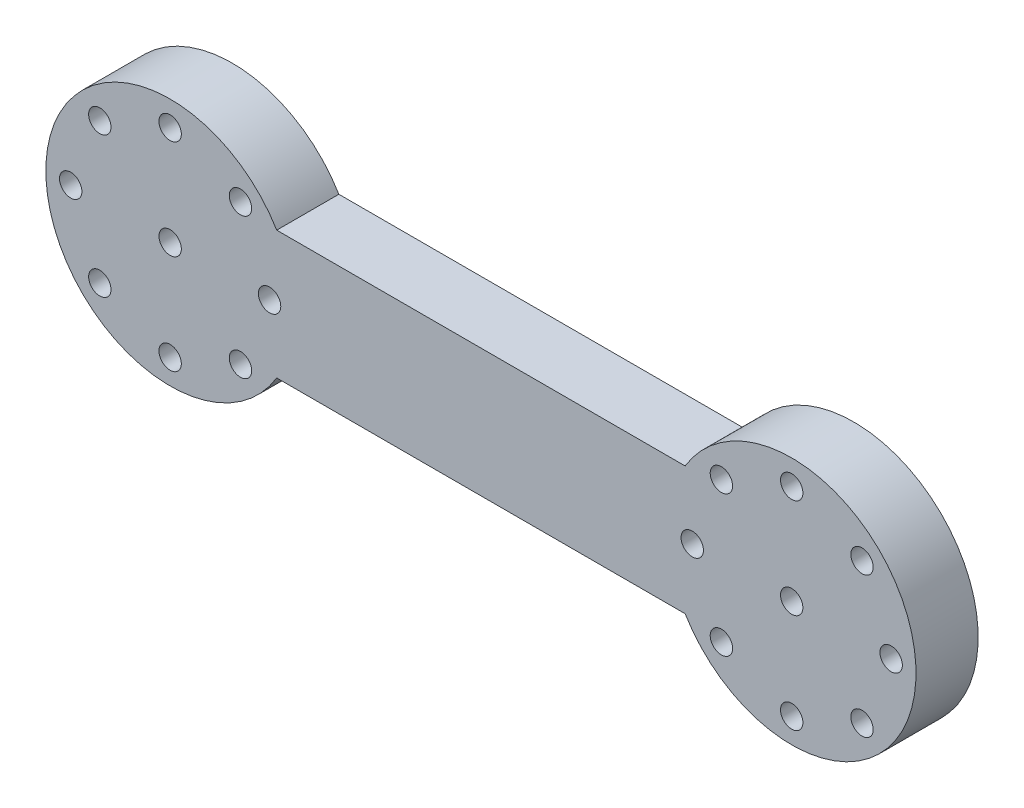
ISO-10303-21;
HEADER;
FILE_DESCRIPTION(('STEP AP214'),'2;1');
FILE_NAME('part.step','',(''),(''),'','','');
FILE_SCHEMA(('AUTOMOTIVE_DESIGN { 1 0 10303 214 1 1 1 1 }'));
ENDSEC;
DATA;
#1=APPLICATION_CONTEXT('core data for automotive mechanical design processes');
#2=APPLICATION_PROTOCOL_DEFINITION('international standard','automotive_design',2000,#1);
#3=PRODUCT_CONTEXT('',#1,'mechanical');
#4=PRODUCT('Part','Part','',(#3));
#5=PRODUCT_RELATED_PRODUCT_CATEGORY('part','',(#4));
#6=PRODUCT_DEFINITION_FORMATION('','',#4);
#7=PRODUCT_DEFINITION_CONTEXT('part definition',#1,'design');
#8=PRODUCT_DEFINITION('design','',#6,#7);
#9=PRODUCT_DEFINITION_SHAPE('','',#8);
#10=(LENGTH_UNIT() NAMED_UNIT(*) SI_UNIT(.MILLI.,.METRE.));
#11=(NAMED_UNIT(*) PLANE_ANGLE_UNIT() SI_UNIT($,.RADIAN.));
#12=(NAMED_UNIT(*) SI_UNIT($,.STERADIAN.) SOLID_ANGLE_UNIT());
#13=UNCERTAINTY_MEASURE_WITH_UNIT(LENGTH_MEASURE(1.E-05),#10,'distance_accuracy_value','');
#14=(GEOMETRIC_REPRESENTATION_CONTEXT(3) GLOBAL_UNCERTAINTY_ASSIGNED_CONTEXT((#13)) GLOBAL_UNIT_ASSIGNED_CONTEXT((#10,
#11,#12)) REPRESENTATION_CONTEXT('',''));
#15=CARTESIAN_POINT('',(0.,0.,0.));
#16=DIRECTION('',(0.,0.,1.));
#17=DIRECTION('',(1.,0.,0.));
#18=AXIS2_PLACEMENT_3D('',#15,#16,#17);
#19=CARTESIAN_POINT('',(0.,0.,5.));
#20=DIRECTION('',(0.,0.,-1.));
#21=DIRECTION('',(-1.,0.,0.));
#22=AXIS2_PLACEMENT_3D('',#19,#20,#21);
#23=CYLINDRICAL_SURFACE('',#22,2.45);
#24=CARTESIAN_POINT('',(0.,0.,0.));
#25=DIRECTION('',(0.,0.,1.));
#26=DIRECTION('',(1.,0.,0.));
#27=AXIS2_PLACEMENT_3D('',#24,#25,#26);
#28=CIRCLE('',#27,2.45);
#29=CARTESIAN_POINT('',(2.45,0.,0.));
#30=VERTEX_POINT('',#29);
#31=EDGE_CURVE('E96',#30,#30,#28,.T.);
#32=ORIENTED_EDGE('',*,*,#31,.F.);
#33=EDGE_LOOP('',(#32));
#34=FACE_BOUND('',#33,.T.);
#35=CARTESIAN_POINT('',(0.,0.,2.47));
#36=DIRECTION('',(0.,0.,1.));
#37=DIRECTION('',(1.,0.,0.));
#38=AXIS2_PLACEMENT_3D('',#35,#36,#37);
#39=CIRCLE('',#38,2.45);
#40=CARTESIAN_POINT('',(2.45,0.,2.47));
#41=VERTEX_POINT('',#40);
#42=EDGE_CURVE('E218',#41,#41,#39,.T.);
#43=ORIENTED_EDGE('',*,*,#42,.T.);
#44=EDGE_LOOP('',(#43));
#45=FACE_BOUND('',#44,.T.);
#46=ADVANCED_FACE('F32',(#34,#45),#23,.F.);
#47=CARTESIAN_POINT('',(0.,0.,5.));
#48=DIRECTION('',(0.,0.,1.));
#49=DIRECTION('',(1.,0.,0.));
#50=AXIS2_PLACEMENT_3D('',#47,#48,#49);
#51=PLANE('',#50);
#52=CARTESIAN_POINT('',(50.,8.00000000000001,5.));
#53=DIRECTION('',(0.,0.,1.));
#54=DIRECTION('',(-1.,0.,0.));
#55=AXIS2_PLACEMENT_3D('',#52,#53,#54);
#56=CIRCLE('',#55,0.899999999999997);
#57=CARTESIAN_POINT('',(49.1,8.00000000000001,5.));
#58=VERTEX_POINT('',#57);
#59=EDGE_CURVE('E171',#58,#58,#56,.T.);
#60=ORIENTED_EDGE('',*,*,#59,.F.);
#61=EDGE_LOOP('',(#60));
#62=FACE_BOUND('',#61,.T.);
#63=CARTESIAN_POINT('',(55.6568542494924,5.65685424949239,5.));
#64=DIRECTION('',(0.,0.,1.));
#65=DIRECTION('',(-1.,0.,0.));
#66=AXIS2_PLACEMENT_3D('',#63,#64,#65);
#67=CIRCLE('',#66,0.899999999999997);
#68=CARTESIAN_POINT('',(54.7568542494924,5.65685424949239,5.));
#69=VERTEX_POINT('',#68);
#70=EDGE_CURVE('E161',#69,#69,#67,.T.);
#71=ORIENTED_EDGE('',*,*,#70,.F.);
#72=EDGE_LOOP('',(#71));
#73=FACE_BOUND('',#72,.T.);
#74=CARTESIAN_POINT('',(58.,0.,5.));
#75=DIRECTION('',(0.,0.,1.));
#76=DIRECTION('',(-1.,0.,0.));
#77=AXIS2_PLACEMENT_3D('',#74,#75,#76);
#78=CIRCLE('',#77,0.899999999999997);
#79=CARTESIAN_POINT('',(57.1,0.,5.));
#80=VERTEX_POINT('',#79);
#81=EDGE_CURVE('E158',#80,#80,#78,.T.);
#82=ORIENTED_EDGE('',*,*,#81,.F.);
#83=EDGE_LOOP('',(#82));
#84=FACE_BOUND('',#83,.T.);
#85=CARTESIAN_POINT('',(55.6568542494924,-5.65685424949237,5.));
#86=DIRECTION('',(0.,0.,1.));
#87=DIRECTION('',(-1.,0.,0.));
#88=AXIS2_PLACEMENT_3D('',#85,#86,#87);
#89=CIRCLE('',#88,0.899999999999997);
#90=CARTESIAN_POINT('',(54.7568542494924,-5.65685424949237,5.));
#91=VERTEX_POINT('',#90);
#92=EDGE_CURVE('E155',#91,#91,#89,.T.);
#93=ORIENTED_EDGE('',*,*,#92,.F.);
#94=EDGE_LOOP('',(#93));
#95=FACE_BOUND('',#94,.T.);
#96=CARTESIAN_POINT('',(50.,-7.99999999999999,5.));
#97=DIRECTION('',(0.,0.,1.));
#98=DIRECTION('',(-1.,0.,0.));
#99=AXIS2_PLACEMENT_3D('',#96,#97,#98);
#100=CIRCLE('',#99,0.899999999999997);
#101=CARTESIAN_POINT('',(49.1,-7.99999999999999,5.));
#102=VERTEX_POINT('',#101);
#103=EDGE_CURVE('E151',#102,#102,#100,.T.);
#104=ORIENTED_EDGE('',*,*,#103,.F.);
#105=EDGE_LOOP('',(#104));
#106=FACE_BOUND('',#105,.T.);
#107=CARTESIAN_POINT('',(44.3431457505076,-5.65685424949238,5.));
#108=DIRECTION('',(0.,0.,1.));
#109=DIRECTION('',(-1.,0.,0.));
#110=AXIS2_PLACEMENT_3D('',#107,#108,#109);
#111=CIRCLE('',#110,0.899999999999997);
#112=CARTESIAN_POINT('',(43.4431457505076,-5.65685424949238,5.));
#113=VERTEX_POINT('',#112);
#114=EDGE_CURVE('E147',#113,#113,#111,.T.);
#115=ORIENTED_EDGE('',*,*,#114,.F.);
#116=EDGE_LOOP('',(#115));
#117=FACE_BOUND('',#116,.T.);
#118=CARTESIAN_POINT('',(42.,0.,5.));
#119=DIRECTION('',(0.,0.,1.));
#120=DIRECTION('',(-1.,0.,0.));
#121=AXIS2_PLACEMENT_3D('',#118,#119,#120);
#122=CIRCLE('',#121,0.899999999999997);
#123=CARTESIAN_POINT('',(41.1,0.,5.));
#124=VERTEX_POINT('',#123);
#125=EDGE_CURVE('E143',#124,#124,#122,.T.);
#126=ORIENTED_EDGE('',*,*,#125,.F.);
#127=EDGE_LOOP('',(#126));
#128=FACE_BOUND('',#127,.T.);
#129=CARTESIAN_POINT('',(44.3431457505076,5.65685424949239,5.));
#130=DIRECTION('',(0.,0.,1.));
#131=DIRECTION('',(-1.,0.,0.));
#132=AXIS2_PLACEMENT_3D('',#129,#130,#131);
#133=CIRCLE('',#132,0.899999999999997);
#134=CARTESIAN_POINT('',(43.4431457505076,5.65685424949239,5.));
#135=VERTEX_POINT('',#134);
#136=EDGE_CURVE('E139',#135,#135,#133,.T.);
#137=ORIENTED_EDGE('',*,*,#136,.F.);
#138=EDGE_LOOP('',(#137));
#139=FACE_BOUND('',#138,.T.);
#140=CARTESIAN_POINT('',(-5.65685424949238,-5.65685424949238,5.));
#141=DIRECTION('',(0.,0.,1.));
#142=DIRECTION('',(1.,0.,0.));
#143=AXIS2_PLACEMENT_3D('',#140,#141,#142);
#144=CIRCLE('',#143,0.899999999999999);
#145=CARTESIAN_POINT('',(-4.75685424949238,-5.65685424949238,5.));
#146=VERTEX_POINT('',#145);
#147=EDGE_CURVE('E135',#146,#146,#144,.T.);
#148=ORIENTED_EDGE('',*,*,#147,.F.);
#149=EDGE_LOOP('',(#148));
#150=FACE_BOUND('',#149,.T.);
#151=CARTESIAN_POINT('',(0.,-8.,5.));
#152=DIRECTION('',(0.,0.,1.));
#153=DIRECTION('',(1.,0.,0.));
#154=AXIS2_PLACEMENT_3D('',#151,#152,#153);
#155=CIRCLE('',#154,0.9);
#156=CARTESIAN_POINT('',(0.900000000000001,-8.,5.));
#157=VERTEX_POINT('',#156);
#158=EDGE_CURVE('E131',#157,#157,#155,.T.);
#159=ORIENTED_EDGE('',*,*,#158,.F.);
#160=EDGE_LOOP('',(#159));
#161=FACE_BOUND('',#160,.T.);
#162=CARTESIAN_POINT('',(5.65685424949238,-5.65685424949238,5.));
#163=DIRECTION('',(0.,0.,1.));
#164=DIRECTION('',(1.,0.,0.));
#165=AXIS2_PLACEMENT_3D('',#162,#163,#164);
#166=CIRCLE('',#165,0.899999999999999);
#167=CARTESIAN_POINT('',(6.55685424949238,-5.65685424949238,5.));
#168=VERTEX_POINT('',#167);
#169=EDGE_CURVE('E127',#168,#168,#166,.T.);
#170=ORIENTED_EDGE('',*,*,#169,.F.);
#171=EDGE_LOOP('',(#170));
#172=FACE_BOUND('',#171,.T.);
#173=CARTESIAN_POINT('',(8.,0.,5.));
#174=DIRECTION('',(0.,0.,1.));
#175=DIRECTION('',(1.,0.,0.));
#176=AXIS2_PLACEMENT_3D('',#173,#174,#175);
#177=CIRCLE('',#176,0.9);
#178=CARTESIAN_POINT('',(8.9,0.,5.));
#179=VERTEX_POINT('',#178);
#180=EDGE_CURVE('E123',#179,#179,#177,.T.);
#181=ORIENTED_EDGE('',*,*,#180,.F.);
#182=EDGE_LOOP('',(#181));
#183=FACE_BOUND('',#182,.T.);
#184=CARTESIAN_POINT('',(5.65685424949238,5.65685424949238,5.));
#185=DIRECTION('',(0.,0.,1.));
#186=DIRECTION('',(1.,0.,0.));
#187=AXIS2_PLACEMENT_3D('',#184,#185,#186);
#188=CIRCLE('',#187,0.899999999999999);
#189=CARTESIAN_POINT('',(6.55685424949238,5.65685424949238,5.));
#190=VERTEX_POINT('',#189);
#191=EDGE_CURVE('E119',#190,#190,#188,.T.);
#192=ORIENTED_EDGE('',*,*,#191,.F.);
#193=EDGE_LOOP('',(#192));
#194=FACE_BOUND('',#193,.T.);
#195=CARTESIAN_POINT('',(0.,8.,5.));
#196=DIRECTION('',(0.,0.,1.));
#197=DIRECTION('',(1.,0.,0.));
#198=AXIS2_PLACEMENT_3D('',#195,#196,#197);
#199=CIRCLE('',#198,0.9);
#200=CARTESIAN_POINT('',(0.899999999999999,8.,5.));
#201=VERTEX_POINT('',#200);
#202=EDGE_CURVE('E115',#201,#201,#199,.T.);
#203=ORIENTED_EDGE('',*,*,#202,.F.);
#204=EDGE_LOOP('',(#203));
#205=FACE_BOUND('',#204,.T.);
#206=CARTESIAN_POINT('',(-5.65685424949238,5.65685424949238,5.));
#207=DIRECTION('',(0.,0.,1.));
#208=DIRECTION('',(1.,0.,0.));
#209=AXIS2_PLACEMENT_3D('',#206,#207,#208);
#210=CIRCLE('',#209,0.899999999999999);
#211=CARTESIAN_POINT('',(-4.75685424949238,5.65685424949238,5.));
#212=VERTEX_POINT('',#211);
#213=EDGE_CURVE('E111',#212,#212,#210,.T.);
#214=ORIENTED_EDGE('',*,*,#213,.F.);
#215=EDGE_LOOP('',(#214));
#216=FACE_BOUND('',#215,.T.);
#217=CARTESIAN_POINT('',(-8.,0.,5.));
#218=DIRECTION('',(0.,0.,1.));
#219=DIRECTION('',(1.,0.,0.));
#220=AXIS2_PLACEMENT_3D('',#217,#218,#219);
#221=CIRCLE('',#220,0.899999999999999);
#222=CARTESIAN_POINT('',(-7.1,0.,5.));
#223=VERTEX_POINT('',#222);
#224=EDGE_CURVE('E107',#223,#223,#221,.T.);
#225=ORIENTED_EDGE('',*,*,#224,.F.);
#226=EDGE_LOOP('',(#225));
#227=FACE_BOUND('',#226,.T.);
#228=DIRECTION('',(1.,0.,0.));
#229=VECTOR('',#228,1.);
#230=CARTESIAN_POINT('',(0.,-5.14773184930253,5.));
#231=LINE('',#230,#229);
#232=CARTESIAN_POINT('',(8.57326406963394,-5.14773184930253,5.));
#233=VERTEX_POINT('',#232);
#234=CARTESIAN_POINT('',(41.4267359303661,-5.14773184930253,5.));
#235=VERTEX_POINT('',#234);
#236=EDGE_CURVE('E92',#233,#235,#231,.T.);
#237=ORIENTED_EDGE('',*,*,#236,.T.);
#238=CARTESIAN_POINT('',(50.,0.,5.));
#239=DIRECTION('',(0.,0.,1.));
#240=DIRECTION('',(1.,0.,0.));
#241=AXIS2_PLACEMENT_3D('',#238,#239,#240);
#242=CIRCLE('',#241,10.);
#243=CARTESIAN_POINT('',(41.4267359303661,5.14773184930253,5.));
#244=VERTEX_POINT('',#243);
#245=EDGE_CURVE('E49',#235,#244,#242,.T.);
#246=ORIENTED_EDGE('',*,*,#245,.T.);
#247=DIRECTION('',(-1.,0.,0.));
#248=VECTOR('',#247,1.);
#249=CARTESIAN_POINT('',(0.,5.14773184930253,5.));
#250=LINE('',#249,#248);
#251=CARTESIAN_POINT('',(8.57326406963394,5.14773184930253,5.));
#252=VERTEX_POINT('',#251);
#253=EDGE_CURVE('E89',#244,#252,#250,.T.);
#254=ORIENTED_EDGE('',*,*,#253,.T.);
#255=CARTESIAN_POINT('',(0.,0.,5.));
#256=DIRECTION('',(0.,0.,1.));
#257=DIRECTION('',(1.,0.,0.));
#258=AXIS2_PLACEMENT_3D('',#255,#256,#257);
#259=CIRCLE('',#258,10.);
#260=EDGE_CURVE('E202',#252,#233,#259,.T.);
#261=ORIENTED_EDGE('',*,*,#260,.T.);
#262=EDGE_LOOP('',(#237,#246,#254,#261));
#263=FACE_BOUND('',#262,.T.);
#264=CARTESIAN_POINT('',(0.,0.,5.));
#265=DIRECTION('',(0.,0.,1.));
#266=DIRECTION('',(1.,0.,0.));
#267=AXIS2_PLACEMENT_3D('',#264,#265,#266);
#268=CIRCLE('',#267,0.9);
#269=CARTESIAN_POINT('',(0.9,0.,5.));
#270=VERTEX_POINT('',#269);
#271=EDGE_CURVE('E212',#270,#270,#268,.T.);
#272=ORIENTED_EDGE('',*,*,#271,.F.);
#273=EDGE_LOOP('',(#272));
#274=FACE_BOUND('',#273,.T.);
#275=CARTESIAN_POINT('',(50.,0.,5.));
#276=DIRECTION('',(0.,0.,1.));
#277=DIRECTION('',(-1.,0.,0.));
#278=AXIS2_PLACEMENT_3D('',#275,#276,#277);
#279=CIRCLE('',#278,0.899999999999997);
#280=CARTESIAN_POINT('',(49.1,0.,5.));
#281=VERTEX_POINT('',#280);
#282=EDGE_CURVE('E208',#281,#281,#279,.T.);
#283=ORIENTED_EDGE('',*,*,#282,.F.);
#284=EDGE_LOOP('',(#283));
#285=FACE_BOUND('',#284,.T.);
#286=ADVANCED_FACE('F228',(#62,#73,#84,#95,#106,#117,#128,#139,#150,#161,#172,#183,#194,#205,
#216,#227,#263,#274,#285),#51,.T.);
#287=CARTESIAN_POINT('',(0.,0.,0.));
#288=DIRECTION('',(0.,0.,1.));
#289=DIRECTION('',(1.,0.,0.));
#290=AXIS2_PLACEMENT_3D('',#287,#288,#289);
#291=PLANE('',#290);
#292=CARTESIAN_POINT('',(50.,8.00000000000001,0.));
#293=DIRECTION('',(0.,0.,1.));
#294=DIRECTION('',(1.,0.,0.));
#295=AXIS2_PLACEMENT_3D('',#292,#293,#294);
#296=CIRCLE('',#295,0.899999999999997);
#297=CARTESIAN_POINT('',(50.9,8.00000000000001,0.));
#298=VERTEX_POINT('',#297);
#299=EDGE_CURVE('E36',#298,#298,#296,.T.);
#300=ORIENTED_EDGE('',*,*,#299,.T.);
#301=EDGE_LOOP('',(#300));
#302=FACE_BOUND('',#301,.T.);
#303=CARTESIAN_POINT('',(55.6568542494924,5.65685424949239,0.));
#304=DIRECTION('',(0.,0.,1.));
#305=DIRECTION('',(1.,0.,0.));
#306=AXIS2_PLACEMENT_3D('',#303,#304,#305);
#307=CIRCLE('',#306,0.899999999999997);
#308=CARTESIAN_POINT('',(56.5568542494924,5.65685424949239,0.));
#309=VERTEX_POINT('',#308);
#310=EDGE_CURVE('E159',#309,#309,#307,.T.);
#311=ORIENTED_EDGE('',*,*,#310,.T.);
#312=EDGE_LOOP('',(#311));
#313=FACE_BOUND('',#312,.T.);
#314=CARTESIAN_POINT('',(58.,0.,0.));
#315=DIRECTION('',(0.,0.,1.));
#316=DIRECTION('',(1.,0.,0.));
#317=AXIS2_PLACEMENT_3D('',#314,#315,#316);
#318=CIRCLE('',#317,0.899999999999997);
#319=CARTESIAN_POINT('',(58.9,0.,0.));
#320=VERTEX_POINT('',#319);
#321=EDGE_CURVE('E156',#320,#320,#318,.T.);
#322=ORIENTED_EDGE('',*,*,#321,.T.);
#323=EDGE_LOOP('',(#322));
#324=FACE_BOUND('',#323,.T.);
#325=CARTESIAN_POINT('',(55.6568542494924,-5.65685424949237,0.));
#326=DIRECTION('',(0.,0.,1.));
#327=DIRECTION('',(1.,0.,0.));
#328=AXIS2_PLACEMENT_3D('',#325,#326,#327);
#329=CIRCLE('',#328,0.899999999999997);
#330=CARTESIAN_POINT('',(56.5568542494924,-5.65685424949237,0.));
#331=VERTEX_POINT('',#330);
#332=EDGE_CURVE('E152',#331,#331,#329,.T.);
#333=ORIENTED_EDGE('',*,*,#332,.T.);
#334=EDGE_LOOP('',(#333));
#335=FACE_BOUND('',#334,.T.);
#336=CARTESIAN_POINT('',(50.,-7.99999999999999,0.));
#337=DIRECTION('',(0.,0.,1.));
#338=DIRECTION('',(1.,0.,0.));
#339=AXIS2_PLACEMENT_3D('',#336,#337,#338);
#340=CIRCLE('',#339,0.899999999999997);
#341=CARTESIAN_POINT('',(50.9,-7.99999999999999,0.));
#342=VERTEX_POINT('',#341);
#343=EDGE_CURVE('E148',#342,#342,#340,.T.);
#344=ORIENTED_EDGE('',*,*,#343,.T.);
#345=EDGE_LOOP('',(#344));
#346=FACE_BOUND('',#345,.T.);
#347=CARTESIAN_POINT('',(44.3431457505076,-5.65685424949238,0.));
#348=DIRECTION('',(0.,0.,1.));
#349=DIRECTION('',(1.,0.,0.));
#350=AXIS2_PLACEMENT_3D('',#347,#348,#349);
#351=CIRCLE('',#350,0.899999999999997);
#352=CARTESIAN_POINT('',(45.2431457505076,-5.65685424949238,0.));
#353=VERTEX_POINT('',#352);
#354=EDGE_CURVE('E144',#353,#353,#351,.T.);
#355=ORIENTED_EDGE('',*,*,#354,.T.);
#356=EDGE_LOOP('',(#355));
#357=FACE_BOUND('',#356,.T.);
#358=CARTESIAN_POINT('',(42.,0.,0.));
#359=DIRECTION('',(0.,0.,1.));
#360=DIRECTION('',(1.,0.,0.));
#361=AXIS2_PLACEMENT_3D('',#358,#359,#360);
#362=CIRCLE('',#361,0.899999999999997);
#363=CARTESIAN_POINT('',(42.9,0.,0.));
#364=VERTEX_POINT('',#363);
#365=EDGE_CURVE('E140',#364,#364,#362,.T.);
#366=ORIENTED_EDGE('',*,*,#365,.T.);
#367=EDGE_LOOP('',(#366));
#368=FACE_BOUND('',#367,.T.);
#369=CARTESIAN_POINT('',(44.3431457505076,5.65685424949239,0.));
#370=DIRECTION('',(0.,0.,1.));
#371=DIRECTION('',(1.,0.,0.));
#372=AXIS2_PLACEMENT_3D('',#369,#370,#371);
#373=CIRCLE('',#372,0.899999999999997);
#374=CARTESIAN_POINT('',(45.2431457505076,5.65685424949239,0.));
#375=VERTEX_POINT('',#374);
#376=EDGE_CURVE('E136',#375,#375,#373,.T.);
#377=ORIENTED_EDGE('',*,*,#376,.T.);
#378=EDGE_LOOP('',(#377));
#379=FACE_BOUND('',#378,.T.);
#380=CARTESIAN_POINT('',(-5.65685424949238,-5.65685424949238,0.));
#381=DIRECTION('',(0.,0.,1.));
#382=DIRECTION('',(1.,0.,0.));
#383=AXIS2_PLACEMENT_3D('',#380,#381,#382);
#384=CIRCLE('',#383,0.899999999999999);
#385=CARTESIAN_POINT('',(-4.75685424949238,-5.65685424949238,0.));
#386=VERTEX_POINT('',#385);
#387=EDGE_CURVE('E132',#386,#386,#384,.T.);
#388=ORIENTED_EDGE('',*,*,#387,.T.);
#389=EDGE_LOOP('',(#388));
#390=FACE_BOUND('',#389,.T.);
#391=CARTESIAN_POINT('',(0.,-8.,0.));
#392=DIRECTION('',(0.,0.,1.));
#393=DIRECTION('',(1.,0.,0.));
#394=AXIS2_PLACEMENT_3D('',#391,#392,#393);
#395=CIRCLE('',#394,0.9);
#396=CARTESIAN_POINT('',(0.900000000000001,-8.,0.));
#397=VERTEX_POINT('',#396);
#398=EDGE_CURVE('E128',#397,#397,#395,.T.);
#399=ORIENTED_EDGE('',*,*,#398,.T.);
#400=EDGE_LOOP('',(#399));
#401=FACE_BOUND('',#400,.T.);
#402=CARTESIAN_POINT('',(5.65685424949238,-5.65685424949238,0.));
#403=DIRECTION('',(0.,0.,1.));
#404=DIRECTION('',(1.,0.,0.));
#405=AXIS2_PLACEMENT_3D('',#402,#403,#404);
#406=CIRCLE('',#405,0.899999999999999);
#407=CARTESIAN_POINT('',(6.55685424949238,-5.65685424949238,0.));
#408=VERTEX_POINT('',#407);
#409=EDGE_CURVE('E124',#408,#408,#406,.T.);
#410=ORIENTED_EDGE('',*,*,#409,.T.);
#411=EDGE_LOOP('',(#410));
#412=FACE_BOUND('',#411,.T.);
#413=CARTESIAN_POINT('',(8.,0.,0.));
#414=DIRECTION('',(0.,0.,1.));
#415=DIRECTION('',(1.,0.,0.));
#416=AXIS2_PLACEMENT_3D('',#413,#414,#415);
#417=CIRCLE('',#416,0.9);
#418=CARTESIAN_POINT('',(8.9,0.,0.));
#419=VERTEX_POINT('',#418);
#420=EDGE_CURVE('E120',#419,#419,#417,.T.);
#421=ORIENTED_EDGE('',*,*,#420,.T.);
#422=EDGE_LOOP('',(#421));
#423=FACE_BOUND('',#422,.T.);
#424=CARTESIAN_POINT('',(5.65685424949238,5.65685424949238,0.));
#425=DIRECTION('',(0.,0.,1.));
#426=DIRECTION('',(1.,0.,0.));
#427=AXIS2_PLACEMENT_3D('',#424,#425,#426);
#428=CIRCLE('',#427,0.899999999999999);
#429=CARTESIAN_POINT('',(6.55685424949238,5.65685424949238,0.));
#430=VERTEX_POINT('',#429);
#431=EDGE_CURVE('E116',#430,#430,#428,.T.);
#432=ORIENTED_EDGE('',*,*,#431,.T.);
#433=EDGE_LOOP('',(#432));
#434=FACE_BOUND('',#433,.T.);
#435=CARTESIAN_POINT('',(0.,8.,0.));
#436=DIRECTION('',(0.,0.,1.));
#437=DIRECTION('',(1.,0.,0.));
#438=AXIS2_PLACEMENT_3D('',#435,#436,#437);
#439=CIRCLE('',#438,0.9);
#440=CARTESIAN_POINT('',(0.899999999999999,8.,0.));
#441=VERTEX_POINT('',#440);
#442=EDGE_CURVE('E112',#441,#441,#439,.T.);
#443=ORIENTED_EDGE('',*,*,#442,.T.);
#444=EDGE_LOOP('',(#443));
#445=FACE_BOUND('',#444,.T.);
#446=CARTESIAN_POINT('',(-5.65685424949238,5.65685424949238,0.));
#447=DIRECTION('',(0.,0.,1.));
#448=DIRECTION('',(1.,0.,0.));
#449=AXIS2_PLACEMENT_3D('',#446,#447,#448);
#450=CIRCLE('',#449,0.899999999999999);
#451=CARTESIAN_POINT('',(-4.75685424949238,5.65685424949238,0.));
#452=VERTEX_POINT('',#451);
#453=EDGE_CURVE('E108',#452,#452,#450,.T.);
#454=ORIENTED_EDGE('',*,*,#453,.T.);
#455=EDGE_LOOP('',(#454));
#456=FACE_BOUND('',#455,.T.);
#457=CARTESIAN_POINT('',(-8.,0.,0.));
#458=DIRECTION('',(0.,0.,1.));
#459=DIRECTION('',(1.,0.,0.));
#460=AXIS2_PLACEMENT_3D('',#457,#458,#459);
#461=CIRCLE('',#460,0.899999999999999);
#462=CARTESIAN_POINT('',(-7.1,0.,0.));
#463=VERTEX_POINT('',#462);
#464=EDGE_CURVE('E104',#463,#463,#461,.T.);
#465=ORIENTED_EDGE('',*,*,#464,.T.);
#466=EDGE_LOOP('',(#465));
#467=FACE_BOUND('',#466,.T.);
#468=DIRECTION('',(-1.,0.,0.));
#469=VECTOR('',#468,1.);
#470=CARTESIAN_POINT('',(0.,5.14773184930253,0.));
#471=LINE('',#470,#469);
#472=CARTESIAN_POINT('',(41.4267359303661,5.14773184930253,0.));
#473=VERTEX_POINT('',#472);
#474=CARTESIAN_POINT('',(8.57326406963394,5.14773184930253,0.));
#475=VERTEX_POINT('',#474);
#476=EDGE_CURVE('E88',#473,#475,#471,.T.);
#477=ORIENTED_EDGE('',*,*,#476,.F.);
#478=CARTESIAN_POINT('',(50.,0.,0.));
#479=DIRECTION('',(0.,0.,1.));
#480=DIRECTION('',(1.,0.,0.));
#481=AXIS2_PLACEMENT_3D('',#478,#479,#480);
#482=CIRCLE('',#481,10.);
#483=CARTESIAN_POINT('',(41.4267359303661,-5.14773184930253,0.));
#484=VERTEX_POINT('',#483);
#485=EDGE_CURVE('E75',#484,#473,#482,.T.);
#486=ORIENTED_EDGE('',*,*,#485,.F.);
#487=DIRECTION('',(1.,0.,0.));
#488=VECTOR('',#487,1.);
#489=CARTESIAN_POINT('',(0.,-5.14773184930253,0.));
#490=LINE('',#489,#488);
#491=CARTESIAN_POINT('',(8.57326406963394,-5.14773184930253,0.));
#492=VERTEX_POINT('',#491);
#493=EDGE_CURVE('E93',#492,#484,#490,.T.);
#494=ORIENTED_EDGE('',*,*,#493,.F.);
#495=CARTESIAN_POINT('',(0.,0.,0.));
#496=DIRECTION('',(0.,0.,1.));
#497=DIRECTION('',(1.,0.,0.));
#498=AXIS2_PLACEMENT_3D('',#495,#496,#497);
#499=CIRCLE('',#498,10.);
#500=EDGE_CURVE('E57',#475,#492,#499,.T.);
#501=ORIENTED_EDGE('',*,*,#500,.F.);
#502=EDGE_LOOP('',(#477,#486,#494,#501));
#503=FACE_BOUND('',#502,.T.);
#504=ORIENTED_EDGE('',*,*,#31,.T.);
#505=EDGE_LOOP('',(#504));
#506=FACE_BOUND('',#505,.T.);
#507=CARTESIAN_POINT('',(50.,0.,0.));
#508=DIRECTION('',(0.,0.,1.));
#509=DIRECTION('',(1.,0.,0.));
#510=AXIS2_PLACEMENT_3D('',#507,#508,#509);
#511=CIRCLE('',#510,2.45);
#512=CARTESIAN_POINT('',(52.45,0.,0.));
#513=VERTEX_POINT('',#512);
#514=EDGE_CURVE('E223',#513,#513,#511,.T.);
#515=ORIENTED_EDGE('',*,*,#514,.T.);
#516=EDGE_LOOP('',(#515));
#517=FACE_BOUND('',#516,.T.);
#518=ADVANCED_FACE('F90',(#302,#313,#324,#335,#346,#357,#368,#379,#390,#401,#412,#423,#434,#445,
#456,#467,#503,#506,#517),#291,.F.);
#519=CARTESIAN_POINT('',(0.,-5.14773184930253,5.));
#520=DIRECTION('',(0.,1.,0.));
#521=DIRECTION('',(0.,0.,1.));
#522=AXIS2_PLACEMENT_3D('',#519,#520,#521);
#523=PLANE('',#522);
#524=ORIENTED_EDGE('',*,*,#493,.T.);
#525=DIRECTION('',(0.,0.,1.));
#526=VECTOR('',#525,1.);
#527=CARTESIAN_POINT('',(41.4267359303661,-5.14773184930253,0.));
#528=LINE('',#527,#526);
#529=EDGE_CURVE('E79',#484,#235,#528,.T.);
#530=ORIENTED_EDGE('',*,*,#529,.T.);
#531=ORIENTED_EDGE('',*,*,#236,.F.);
#532=DIRECTION('',(0.,0.,1.));
#533=VECTOR('',#532,1.);
#534=CARTESIAN_POINT('',(8.57326406963394,-5.14773184930253,0.));
#535=LINE('',#534,#533);
#536=EDGE_CURVE('E204',#233,#492,#535,.F.);
#537=ORIENTED_EDGE('',*,*,#536,.T.);
#538=EDGE_LOOP('',(#524,#530,#531,#537));
#539=FACE_BOUND('',#538,.T.);
#540=ADVANCED_FACE('F34',(#539),#523,.F.);
#541=CARTESIAN_POINT('',(0.,5.14773184930253,5.));
#542=DIRECTION('',(0.,-1.,0.));
#543=DIRECTION('',(0.,0.,-1.));
#544=AXIS2_PLACEMENT_3D('',#541,#542,#543);
#545=PLANE('',#544);
#546=ORIENTED_EDGE('',*,*,#253,.F.);
#547=DIRECTION('',(0.,0.,1.));
#548=VECTOR('',#547,1.);
#549=CARTESIAN_POINT('',(41.4267359303661,5.14773184930253,0.));
#550=LINE('',#549,#548);
#551=EDGE_CURVE('E11',#244,#473,#550,.F.);
#552=ORIENTED_EDGE('',*,*,#551,.T.);
#553=ORIENTED_EDGE('',*,*,#476,.T.);
#554=DIRECTION('',(0.,0.,1.));
#555=VECTOR('',#554,1.);
#556=CARTESIAN_POINT('',(8.57326406963394,5.14773184930253,0.));
#557=LINE('',#556,#555);
#558=EDGE_CURVE('E41',#475,#252,#557,.T.);
#559=ORIENTED_EDGE('',*,*,#558,.T.);
#560=EDGE_LOOP('',(#546,#552,#553,#559));
#561=FACE_BOUND('',#560,.T.);
#562=ADVANCED_FACE('F86',(#561),#545,.F.);
#563=CARTESIAN_POINT('',(50.,0.,5.));
#564=DIRECTION('',(0.,0.,-1.));
#565=DIRECTION('',(-1.,0.,0.));
#566=AXIS2_PLACEMENT_3D('',#563,#564,#565);
#567=CYLINDRICAL_SURFACE('',#566,2.45);
#568=CARTESIAN_POINT('',(50.,0.,2.47));
#569=DIRECTION('',(0.,0.,-1.));
#570=DIRECTION('',(-1.,0.,0.));
#571=AXIS2_PLACEMENT_3D('',#568,#569,#570);
#572=CIRCLE('',#571,2.45);
#573=CARTESIAN_POINT('',(47.55,0.,2.47));
#574=VERTEX_POINT('',#573);
#575=EDGE_CURVE('E100',#574,#574,#572,.T.);
#576=ORIENTED_EDGE('',*,*,#575,.F.);
#577=EDGE_LOOP('',(#576));
#578=FACE_BOUND('',#577,.T.);
#579=ORIENTED_EDGE('',*,*,#514,.F.);
#580=EDGE_LOOP('',(#579));
#581=FACE_BOUND('',#580,.T.);
#582=ADVANCED_FACE('F238',(#578,#581),#567,.F.);
#583=CARTESIAN_POINT('',(0.,0.,2.47));
#584=DIRECTION('',(0.,0.,1.));
#585=DIRECTION('',(1.,0.,0.));
#586=AXIS2_PLACEMENT_3D('',#583,#584,#585);
#587=PLANE('',#586);
#588=CARTESIAN_POINT('',(0.,0.,2.47));
#589=DIRECTION('',(0.,0.,1.));
#590=DIRECTION('',(1.,0.,0.));
#591=AXIS2_PLACEMENT_3D('',#588,#589,#590);
#592=CIRCLE('',#591,0.9);
#593=CARTESIAN_POINT('',(0.9,0.,2.47));
#594=VERTEX_POINT('',#593);
#595=EDGE_CURVE('E215',#594,#594,#592,.T.);
#596=ORIENTED_EDGE('',*,*,#595,.T.);
#597=EDGE_LOOP('',(#596));
#598=FACE_BOUND('',#597,.T.);
#599=ORIENTED_EDGE('',*,*,#42,.F.);
#600=EDGE_LOOP('',(#599));
#601=FACE_BOUND('',#600,.T.);
#602=ADVANCED_FACE('F254',(#598,#601),#587,.F.);
#603=CARTESIAN_POINT('',(0.,0.,2.47));
#604=DIRECTION('',(0.,0.,1.));
#605=DIRECTION('',(1.,0.,0.));
#606=AXIS2_PLACEMENT_3D('',#603,#604,#605);
#607=CYLINDRICAL_SURFACE('',#606,0.9);
#608=ORIENTED_EDGE('',*,*,#595,.F.);
#609=EDGE_LOOP('',(#608));
#610=FACE_BOUND('',#609,.T.);
#611=ORIENTED_EDGE('',*,*,#271,.T.);
#612=EDGE_LOOP('',(#611));
#613=FACE_BOUND('',#612,.T.);
#614=ADVANCED_FACE('F258',(#610,#613),#607,.F.);
#615=CARTESIAN_POINT('',(50.,0.,2.47));
#616=DIRECTION('',(0.,0.,-1.));
#617=DIRECTION('',(-1.,0.,0.));
#618=AXIS2_PLACEMENT_3D('',#615,#616,#617);
#619=PLANE('',#618);
#620=CARTESIAN_POINT('',(50.,0.,2.47));
#621=DIRECTION('',(0.,0.,1.));
#622=DIRECTION('',(-1.,0.,0.));
#623=AXIS2_PLACEMENT_3D('',#620,#621,#622);
#624=CIRCLE('',#623,0.899999999999997);
#625=CARTESIAN_POINT('',(49.1,0.,2.47));
#626=VERTEX_POINT('',#625);
#627=EDGE_CURVE('E209',#626,#626,#624,.T.);
#628=ORIENTED_EDGE('',*,*,#627,.T.);
#629=EDGE_LOOP('',(#628));
#630=FACE_BOUND('',#629,.T.);
#631=ORIENTED_EDGE('',*,*,#575,.T.);
#632=EDGE_LOOP('',(#631));
#633=FACE_BOUND('',#632,.T.);
#634=ADVANCED_FACE('F262',(#630,#633),#619,.T.);
#635=CARTESIAN_POINT('',(50.,0.,2.47));
#636=DIRECTION('',(0.,0.,1.));
#637=DIRECTION('',(1.,0.,0.));
#638=AXIS2_PLACEMENT_3D('',#635,#636,#637);
#639=CYLINDRICAL_SURFACE('',#638,0.899999999999997);
#640=ORIENTED_EDGE('',*,*,#627,.F.);
#641=EDGE_LOOP('',(#640));
#642=FACE_BOUND('',#641,.T.);
#643=ORIENTED_EDGE('',*,*,#282,.T.);
#644=EDGE_LOOP('',(#643));
#645=FACE_BOUND('',#644,.T.);
#646=ADVANCED_FACE('F266',(#642,#645),#639,.F.);
#647=CARTESIAN_POINT('',(0.,0.,0.));
#648=DIRECTION('',(0.,0.,1.));
#649=DIRECTION('',(1.,0.,0.));
#650=AXIS2_PLACEMENT_3D('',#647,#648,#649);
#651=CYLINDRICAL_SURFACE('',#650,10.);
#652=ORIENTED_EDGE('',*,*,#536,.F.);
#653=ORIENTED_EDGE('',*,*,#260,.F.);
#654=ORIENTED_EDGE('',*,*,#558,.F.);
#655=ORIENTED_EDGE('',*,*,#500,.T.);
#656=EDGE_LOOP('',(#652,#653,#654,#655));
#657=FACE_BOUND('',#656,.T.);
#658=ADVANCED_FACE('F231',(#657),#651,.T.);
#659=CARTESIAN_POINT('',(50.,0.,0.));
#660=DIRECTION('',(0.,0.,1.));
#661=DIRECTION('',(1.,0.,0.));
#662=AXIS2_PLACEMENT_3D('',#659,#660,#661);
#663=CYLINDRICAL_SURFACE('',#662,10.);
#664=ORIENTED_EDGE('',*,*,#529,.F.);
#665=ORIENTED_EDGE('',*,*,#485,.T.);
#666=ORIENTED_EDGE('',*,*,#551,.F.);
#667=ORIENTED_EDGE('',*,*,#245,.F.);
#668=EDGE_LOOP('',(#664,#665,#666,#667));
#669=FACE_BOUND('',#668,.T.);
#670=ADVANCED_FACE('F76',(#669),#663,.T.);
#671=CARTESIAN_POINT('',(-8.,0.,-5.));
#672=DIRECTION('',(0.,0.,1.));
#673=DIRECTION('',(1.,0.,0.));
#674=AXIS2_PLACEMENT_3D('',#671,#672,#673);
#675=CYLINDRICAL_SURFACE('',#674,0.899999999999999);
#676=ORIENTED_EDGE('',*,*,#224,.T.);
#677=EDGE_LOOP('',(#676));
#678=FACE_BOUND('',#677,.T.);
#679=ORIENTED_EDGE('',*,*,#464,.F.);
#680=EDGE_LOOP('',(#679));
#681=FACE_BOUND('',#680,.T.);
#682=ADVANCED_FACE('F275',(#678,#681),#675,.F.);
#683=CARTESIAN_POINT('',(-5.65685424949238,5.65685424949238,-5.));
#684=DIRECTION('',(0.,0.,1.));
#685=DIRECTION('',(1.,0.,0.));
#686=AXIS2_PLACEMENT_3D('',#683,#684,#685);
#687=CYLINDRICAL_SURFACE('',#686,0.899999999999999);
#688=ORIENTED_EDGE('',*,*,#213,.T.);
#689=EDGE_LOOP('',(#688));
#690=FACE_BOUND('',#689,.T.);
#691=ORIENTED_EDGE('',*,*,#453,.F.);
#692=EDGE_LOOP('',(#691));
#693=FACE_BOUND('',#692,.T.);
#694=ADVANCED_FACE('F278',(#690,#693),#687,.F.);
#695=CARTESIAN_POINT('',(0.,8.,-5.));
#696=DIRECTION('',(0.,0.,1.));
#697=DIRECTION('',(1.,0.,0.));
#698=AXIS2_PLACEMENT_3D('',#695,#696,#697);
#699=CYLINDRICAL_SURFACE('',#698,0.9);
#700=ORIENTED_EDGE('',*,*,#202,.T.);
#701=EDGE_LOOP('',(#700));
#702=FACE_BOUND('',#701,.T.);
#703=ORIENTED_EDGE('',*,*,#442,.F.);
#704=EDGE_LOOP('',(#703));
#705=FACE_BOUND('',#704,.T.);
#706=ADVANCED_FACE('F282',(#702,#705),#699,.F.);
#707=CARTESIAN_POINT('',(5.65685424949238,5.65685424949238,-5.));
#708=DIRECTION('',(0.,0.,1.));
#709=DIRECTION('',(1.,0.,0.));
#710=AXIS2_PLACEMENT_3D('',#707,#708,#709);
#711=CYLINDRICAL_SURFACE('',#710,0.899999999999999);
#712=ORIENTED_EDGE('',*,*,#191,.T.);
#713=EDGE_LOOP('',(#712));
#714=FACE_BOUND('',#713,.T.);
#715=ORIENTED_EDGE('',*,*,#431,.F.);
#716=EDGE_LOOP('',(#715));
#717=FACE_BOUND('',#716,.T.);
#718=ADVANCED_FACE('F286',(#714,#717),#711,.F.);
#719=CARTESIAN_POINT('',(8.,0.,-5.));
#720=DIRECTION('',(0.,0.,1.));
#721=DIRECTION('',(1.,0.,0.));
#722=AXIS2_PLACEMENT_3D('',#719,#720,#721);
#723=CYLINDRICAL_SURFACE('',#722,0.9);
#724=ORIENTED_EDGE('',*,*,#180,.T.);
#725=EDGE_LOOP('',(#724));
#726=FACE_BOUND('',#725,.T.);
#727=ORIENTED_EDGE('',*,*,#420,.F.);
#728=EDGE_LOOP('',(#727));
#729=FACE_BOUND('',#728,.T.);
#730=ADVANCED_FACE('F290',(#726,#729),#723,.F.);
#731=CARTESIAN_POINT('',(5.65685424949238,-5.65685424949238,-5.));
#732=DIRECTION('',(0.,0.,1.));
#733=DIRECTION('',(1.,0.,0.));
#734=AXIS2_PLACEMENT_3D('',#731,#732,#733);
#735=CYLINDRICAL_SURFACE('',#734,0.899999999999999);
#736=ORIENTED_EDGE('',*,*,#169,.T.);
#737=EDGE_LOOP('',(#736));
#738=FACE_BOUND('',#737,.T.);
#739=ORIENTED_EDGE('',*,*,#409,.F.);
#740=EDGE_LOOP('',(#739));
#741=FACE_BOUND('',#740,.T.);
#742=ADVANCED_FACE('F294',(#738,#741),#735,.F.);
#743=CARTESIAN_POINT('',(0.,-8.,-5.));
#744=DIRECTION('',(0.,0.,1.));
#745=DIRECTION('',(1.,0.,0.));
#746=AXIS2_PLACEMENT_3D('',#743,#744,#745);
#747=CYLINDRICAL_SURFACE('',#746,0.9);
#748=ORIENTED_EDGE('',*,*,#158,.T.);
#749=EDGE_LOOP('',(#748));
#750=FACE_BOUND('',#749,.T.);
#751=ORIENTED_EDGE('',*,*,#398,.F.);
#752=EDGE_LOOP('',(#751));
#753=FACE_BOUND('',#752,.T.);
#754=ADVANCED_FACE('F298',(#750,#753),#747,.F.);
#755=CARTESIAN_POINT('',(-5.65685424949238,-5.65685424949238,-5.));
#756=DIRECTION('',(0.,0.,1.));
#757=DIRECTION('',(1.,0.,0.));
#758=AXIS2_PLACEMENT_3D('',#755,#756,#757);
#759=CYLINDRICAL_SURFACE('',#758,0.899999999999999);
#760=ORIENTED_EDGE('',*,*,#147,.T.);
#761=EDGE_LOOP('',(#760));
#762=FACE_BOUND('',#761,.T.);
#763=ORIENTED_EDGE('',*,*,#387,.F.);
#764=EDGE_LOOP('',(#763));
#765=FACE_BOUND('',#764,.T.);
#766=ADVANCED_FACE('F302',(#762,#765),#759,.F.);
#767=CARTESIAN_POINT('',(44.3431457505076,5.65685424949239,-5.));
#768=DIRECTION('',(0.,0.,1.));
#769=DIRECTION('',(1.,0.,0.));
#770=AXIS2_PLACEMENT_3D('',#767,#768,#769);
#771=CYLINDRICAL_SURFACE('',#770,0.899999999999997);
#772=ORIENTED_EDGE('',*,*,#136,.T.);
#773=EDGE_LOOP('',(#772));
#774=FACE_BOUND('',#773,.T.);
#775=ORIENTED_EDGE('',*,*,#376,.F.);
#776=EDGE_LOOP('',(#775));
#777=FACE_BOUND('',#776,.T.);
#778=ADVANCED_FACE('F306',(#774,#777),#771,.F.);
#779=CARTESIAN_POINT('',(42.,0.,-5.));
#780=DIRECTION('',(0.,0.,1.));
#781=DIRECTION('',(1.,0.,0.));
#782=AXIS2_PLACEMENT_3D('',#779,#780,#781);
#783=CYLINDRICAL_SURFACE('',#782,0.899999999999997);
#784=ORIENTED_EDGE('',*,*,#125,.T.);
#785=EDGE_LOOP('',(#784));
#786=FACE_BOUND('',#785,.T.);
#787=ORIENTED_EDGE('',*,*,#365,.F.);
#788=EDGE_LOOP('',(#787));
#789=FACE_BOUND('',#788,.T.);
#790=ADVANCED_FACE('F310',(#786,#789),#783,.F.);
#791=CARTESIAN_POINT('',(44.3431457505076,-5.65685424949238,-5.));
#792=DIRECTION('',(0.,0.,1.));
#793=DIRECTION('',(1.,0.,0.));
#794=AXIS2_PLACEMENT_3D('',#791,#792,#793);
#795=CYLINDRICAL_SURFACE('',#794,0.899999999999997);
#796=ORIENTED_EDGE('',*,*,#114,.T.);
#797=EDGE_LOOP('',(#796));
#798=FACE_BOUND('',#797,.T.);
#799=ORIENTED_EDGE('',*,*,#354,.F.);
#800=EDGE_LOOP('',(#799));
#801=FACE_BOUND('',#800,.T.);
#802=ADVANCED_FACE('F314',(#798,#801),#795,.F.);
#803=CARTESIAN_POINT('',(50.,-7.99999999999999,-5.));
#804=DIRECTION('',(0.,0.,1.));
#805=DIRECTION('',(1.,0.,0.));
#806=AXIS2_PLACEMENT_3D('',#803,#804,#805);
#807=CYLINDRICAL_SURFACE('',#806,0.899999999999997);
#808=ORIENTED_EDGE('',*,*,#103,.T.);
#809=EDGE_LOOP('',(#808));
#810=FACE_BOUND('',#809,.T.);
#811=ORIENTED_EDGE('',*,*,#343,.F.);
#812=EDGE_LOOP('',(#811));
#813=FACE_BOUND('',#812,.T.);
#814=ADVANCED_FACE('F318',(#810,#813),#807,.F.);
#815=CARTESIAN_POINT('',(55.6568542494924,-5.65685424949237,-5.));
#816=DIRECTION('',(0.,0.,1.));
#817=DIRECTION('',(1.,0.,0.));
#818=AXIS2_PLACEMENT_3D('',#815,#816,#817);
#819=CYLINDRICAL_SURFACE('',#818,0.899999999999997);
#820=ORIENTED_EDGE('',*,*,#92,.T.);
#821=EDGE_LOOP('',(#820));
#822=FACE_BOUND('',#821,.T.);
#823=ORIENTED_EDGE('',*,*,#332,.F.);
#824=EDGE_LOOP('',(#823));
#825=FACE_BOUND('',#824,.T.);
#826=ADVANCED_FACE('F322',(#822,#825),#819,.F.);
#827=CARTESIAN_POINT('',(58.,0.,-5.));
#828=DIRECTION('',(0.,0.,1.));
#829=DIRECTION('',(1.,0.,0.));
#830=AXIS2_PLACEMENT_3D('',#827,#828,#829);
#831=CYLINDRICAL_SURFACE('',#830,0.899999999999997);
#832=ORIENTED_EDGE('',*,*,#81,.T.);
#833=EDGE_LOOP('',(#832));
#834=FACE_BOUND('',#833,.T.);
#835=ORIENTED_EDGE('',*,*,#321,.F.);
#836=EDGE_LOOP('',(#835));
#837=FACE_BOUND('',#836,.T.);
#838=ADVANCED_FACE('F326',(#834,#837),#831,.F.);
#839=CARTESIAN_POINT('',(55.6568542494924,5.65685424949239,-5.));
#840=DIRECTION('',(0.,0.,1.));
#841=DIRECTION('',(1.,0.,0.));
#842=AXIS2_PLACEMENT_3D('',#839,#840,#841);
#843=CYLINDRICAL_SURFACE('',#842,0.899999999999997);
#844=ORIENTED_EDGE('',*,*,#70,.T.);
#845=EDGE_LOOP('',(#844));
#846=FACE_BOUND('',#845,.T.);
#847=ORIENTED_EDGE('',*,*,#310,.F.);
#848=EDGE_LOOP('',(#847));
#849=FACE_BOUND('',#848,.T.);
#850=ADVANCED_FACE('F330',(#846,#849),#843,.F.);
#851=CARTESIAN_POINT('',(50.,8.00000000000001,-5.));
#852=DIRECTION('',(0.,0.,1.));
#853=DIRECTION('',(1.,0.,0.));
#854=AXIS2_PLACEMENT_3D('',#851,#852,#853);
#855=CYLINDRICAL_SURFACE('',#854,0.899999999999997);
#856=ORIENTED_EDGE('',*,*,#59,.T.);
#857=EDGE_LOOP('',(#856));
#858=FACE_BOUND('',#857,.T.);
#859=ORIENTED_EDGE('',*,*,#299,.F.);
#860=EDGE_LOOP('',(#859));
#861=FACE_BOUND('',#860,.T.);
#862=ADVANCED_FACE('F334',(#858,#861),#855,.F.);
#863=CLOSED_SHELL('',(#46,#286,#518,#540,#562,#582,#602,#614,#634,#646,#658,#670,#682,#694,#706,
#718,#730,#742,#754,#766,#778,#790,#802,#814,#826,#838,#850,#862));
#864=MANIFOLD_SOLID_BREP('B2',#863);
#865=ADVANCED_BREP_SHAPE_REPRESENTATION('',(#18,#864),#14);
#866=SHAPE_DEFINITION_REPRESENTATION(#9,#865);
ENDSEC;
END-ISO-10303-21;
